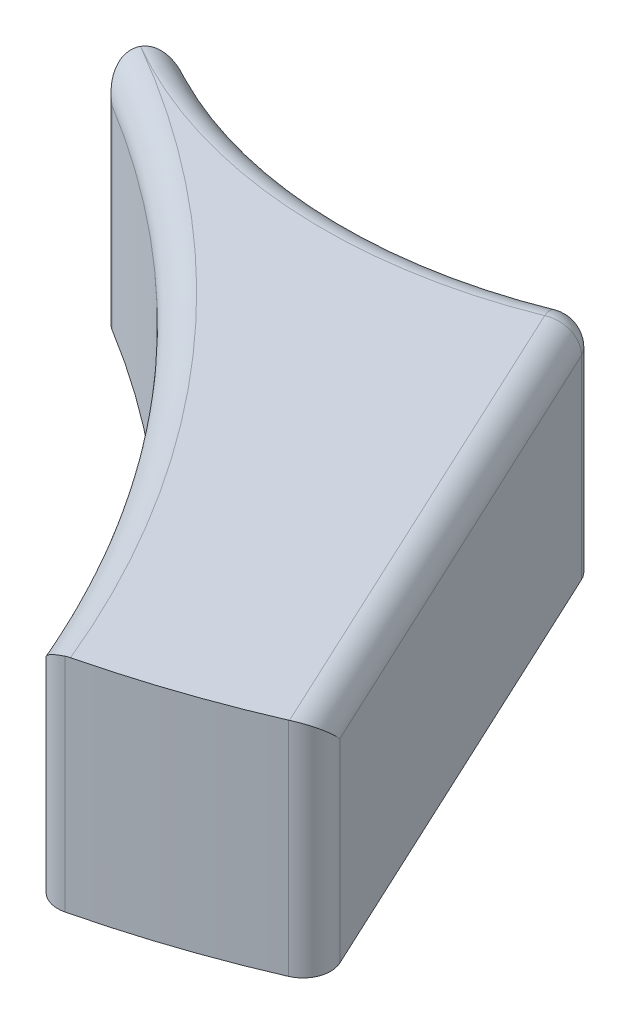
ISO-10303-21;
HEADER;
FILE_DESCRIPTION(('STEP AP214'),'2;1');
FILE_NAME('part.step','',(''),(''),'','','');
FILE_SCHEMA(('AUTOMOTIVE_DESIGN { 1 0 10303 214 1 1 1 1 }'));
ENDSEC;
DATA;
#1=APPLICATION_CONTEXT('core data for automotive mechanical design processes');
#2=APPLICATION_PROTOCOL_DEFINITION('international standard','automotive_design',2000,#1);
#3=PRODUCT_CONTEXT('',#1,'mechanical');
#4=PRODUCT('Part','Part','',(#3));
#5=PRODUCT_RELATED_PRODUCT_CATEGORY('part','',(#4));
#6=PRODUCT_DEFINITION_FORMATION('','',#4);
#7=PRODUCT_DEFINITION_CONTEXT('part definition',#1,'design');
#8=PRODUCT_DEFINITION('design','',#6,#7);
#9=PRODUCT_DEFINITION_SHAPE('','',#8);
#10=(LENGTH_UNIT() NAMED_UNIT(*) SI_UNIT(.MILLI.,.METRE.));
#11=(NAMED_UNIT(*) PLANE_ANGLE_UNIT() SI_UNIT($,.RADIAN.));
#12=(NAMED_UNIT(*) SI_UNIT($,.STERADIAN.) SOLID_ANGLE_UNIT());
#13=UNCERTAINTY_MEASURE_WITH_UNIT(LENGTH_MEASURE(1.E-05),#10,'distance_accuracy_value','');
#14=(GEOMETRIC_REPRESENTATION_CONTEXT(3) GLOBAL_UNCERTAINTY_ASSIGNED_CONTEXT((#13)) GLOBAL_UNIT_ASSIGNED_CONTEXT((#10,
#11,#12)) REPRESENTATION_CONTEXT('',''));
#15=CARTESIAN_POINT('',(0.,0.,0.));
#16=DIRECTION('',(0.,0.,1.));
#17=DIRECTION('',(1.,0.,0.));
#18=AXIS2_PLACEMENT_3D('',#15,#16,#17);
#19=CARTESIAN_POINT('',(-30.0000000000001,3.,51.9615242270664));
#20=DIRECTION('',(0.,-1.,0.));
#21=DIRECTION('',(1.,0.,0.));
#22=AXIS2_PLACEMENT_3D('',#19,#20,#21);
#23=CYLINDRICAL_SURFACE('',#22,41.0000000000002);
#24=CARTESIAN_POINT('',(-30.0000000000001,3.,51.9615242270664));
#25=DIRECTION('',(0.,-1.,0.));
#26=DIRECTION('',(0.500000000000001,0.,-0.866025403784438));
#27=AXIS2_PLACEMENT_3D('',#24,#25,#26);
#28=CIRCLE('',#27,41.0000000000002);
#29=CARTESIAN_POINT('',(-8.66040573002251,3.,16.9526436909403));
#30=VERTEX_POINT('',#29);
#31=CARTESIAN_POINT('',(7.50822965320198,3.,35.404570754804));
#32=VERTEX_POINT('',#31);
#33=EDGE_CURVE('E425',#30,#32,#28,.T.);
#34=ORIENTED_EDGE('',*,*,#33,.T.);
#35=DIRECTION('',(0.,-1.,0.));
#36=VECTOR('',#35,1.);
#37=CARTESIAN_POINT('',(7.50822965320198,2.99999999999999,35.404570754804));
#38=LINE('',#37,#36);
#39=CARTESIAN_POINT('',(7.50822965320198,10.,35.404570754804));
#40=VERTEX_POINT('',#39);
#41=EDGE_CURVE('E313',#32,#40,#38,.F.);
#42=ORIENTED_EDGE('',*,*,#41,.T.);
#43=CARTESIAN_POINT('',(-30.0000000000001,10.,51.9615242270664));
#44=DIRECTION('',(0.,1.,0.));
#45=DIRECTION('',(0.,0.,1.));
#46=AXIS2_PLACEMENT_3D('',#43,#44,#45);
#47=CIRCLE('',#46,41.0000000000002);
#48=CARTESIAN_POINT('',(-8.66040573002251,10.,16.9526436909403));
#49=VERTEX_POINT('',#48);
#50=EDGE_CURVE('E311',#40,#49,#47,.T.);
#51=ORIENTED_EDGE('',*,*,#50,.T.);
#52=DIRECTION('',(0.,-1.,0.));
#53=VECTOR('',#52,1.);
#54=CARTESIAN_POINT('',(-8.66040573002251,2.99999999999999,16.9526436909403));
#55=LINE('',#54,#53);
#56=EDGE_CURVE('E266',#49,#30,#55,.T.);
#57=ORIENTED_EDGE('',*,*,#56,.T.);
#58=EDGE_LOOP('',(#34,#42,#51,#57));
#59=FACE_BOUND('',#58,.T.);
#60=ADVANCED_FACE('F162',(#59),#23,.F.);
#61=CARTESIAN_POINT('',(0.,3.,0.));
#62=DIRECTION('',(0.,1.,0.));
#63=DIRECTION('',(0.,0.,1.));
#64=AXIS2_PLACEMENT_3D('',#61,#62,#63);
#65=PLANE('',#64);
#66=CARTESIAN_POINT('',(3.09904216494226,3.,20.8431268685845));
#67=DIRECTION('',(0.,-1.,0.));
#68=DIRECTION('',(0.,0.,-1.));
#69=AXIS2_PLACEMENT_3D('',#66,#67,#68);
#70=CIRCLE('',#69,2.);
#71=CARTESIAN_POINT('',(3.09904216494226,3.,18.8431268685845));
#72=VERTEX_POINT('',#71);
#73=EDGE_CURVE('E441',#72,#72,#70,.T.);
#74=ORIENTED_EDGE('',*,*,#73,.F.);
#75=EDGE_LOOP('',(#74));
#76=FACE_BOUND('',#75,.T.);
#77=CARTESIAN_POINT('',(9.48297317697624,3.,29.8011079376419));
#78=DIRECTION('',(0.,-1.,0.));
#79=DIRECTION('',(0.,0.,-1.));
#80=AXIS2_PLACEMENT_3D('',#77,#78,#79);
#81=CIRCLE('',#80,2.15);
#82=CARTESIAN_POINT('',(9.48297317697624,3.,27.6511079376419));
#83=VERTEX_POINT('',#82);
#84=EDGE_CURVE('E450',#83,#83,#81,.T.);
#85=ORIENTED_EDGE('',*,*,#84,.F.);
#86=EDGE_LOOP('',(#85));
#87=FACE_BOUND('',#86,.T.);
#88=DIRECTION('',(-0.422618261740701,0.,-0.906307787036649));
#89=VECTOR('',#88,1.);
#90=CARTESIAN_POINT('',(0.,3.,0.));
#91=LINE('',#90,#89);
#92=CARTESIAN_POINT('',(15.2083865918765,3.,32.6144902960637));
#93=VERTEX_POINT('',#92);
#94=CARTESIAN_POINT('',(7.59538024299141,3.,16.2883454949966));
#95=VERTEX_POINT('',#94);
#96=EDGE_CURVE('E262',#93,#95,#91,.T.);
#97=ORIENTED_EDGE('',*,*,#96,.F.);
#98=CARTESIAN_POINT('',(14.3020788048398,3.,33.0371085578044));
#99=DIRECTION('',(0.,1.,0.));
#100=DIRECTION('',(0.,0.,1.));
#101=AXIS2_PLACEMENT_3D('',#98,#99,#100);
#102=CIRCLE('',#101,1.);
#103=CARTESIAN_POINT('',(14.6993587716409,3.,33.9548060177434));
#104=VERTEX_POINT('',#103);
#105=EDGE_CURVE('E257',#93,#104,#102,.F.);
#106=ORIENTED_EDGE('',*,*,#105,.T.);
#107=CARTESIAN_POINT('',(0.,3.,0.));
#108=DIRECTION('',(0.,-1.,0.));
#109=DIRECTION('',(0.,0.,-1.));
#110=AXIS2_PLACEMENT_3D('',#107,#108,#109);
#111=CIRCLE('',#110,37.);
#112=CARTESIAN_POINT('',(8.65703853731427,3.,35.9729854719268));
#113=VERTEX_POINT('',#112);
#114=EDGE_CURVE('E260',#104,#113,#111,.T.);
#115=ORIENTED_EDGE('',*,*,#114,.T.);
#116=CARTESIAN_POINT('',(8.42306452279226,3.,35.0007426213342));
#117=DIRECTION('',(0.,1.,0.));
#118=DIRECTION('',(0.,0.,1.));
#119=AXIS2_PLACEMENT_3D('',#116,#117,#118);
#120=CIRCLE('',#119,1.);
#121=EDGE_CURVE('E267',#113,#32,#120,.F.);
#122=ORIENTED_EDGE('',*,*,#121,.T.);
#123=ORIENTED_EDGE('',*,*,#33,.F.);
#124=CARTESIAN_POINT('',(-8.13992782099866,3.,16.0987685559128));
#125=DIRECTION('',(0.,1.,0.));
#126=DIRECTION('',(0.,0.,1.));
#127=AXIS2_PLACEMENT_3D('',#124,#125,#126);
#128=CIRCLE('',#127,1.);
#129=CARTESIAN_POINT('',(-9.00595322478311,3.,15.5987685559128));
#130=VERTEX_POINT('',#129);
#131=EDGE_CURVE('E305',#30,#130,#128,.F.);
#132=ORIENTED_EDGE('',*,*,#131,.T.);
#133=DIRECTION('',(-0.499999999999998,0.,0.86602540378444));
#134=VECTOR('',#133,1.);
#135=CARTESIAN_POINT('',(-15.0000000000001,3.,25.9807621135331));
#136=LINE('',#135,#134);
#137=CARTESIAN_POINT('',(-8.98610037780584,3.,15.5643824162733));
#138=VERTEX_POINT('',#137);
#139=EDGE_CURVE('E423',#138,#130,#136,.T.);
#140=ORIENTED_EDGE('',*,*,#139,.F.);
#141=CARTESIAN_POINT('',(-8.12007497402139,3.,16.0643824162733));
#142=DIRECTION('',(0.,1.,0.));
#143=DIRECTION('',(0.,0.,1.));
#144=AXIS2_PLACEMENT_3D('',#141,#142,#143);
#145=CIRCLE('',#144,1.);
#146=CARTESIAN_POINT('',(-7.66895969768687,3.,15.1719167264804));
#147=VERTEX_POINT('',#146);
#148=EDGE_CURVE('E303',#138,#147,#145,.F.);
#149=ORIENTED_EDGE('',*,*,#148,.T.);
#150=CARTESIAN_POINT('',(0.,3.,0.));
#151=DIRECTION('',(0.,1.,0.));
#152=DIRECTION('',(0.,0.,1.));
#153=AXIS2_PLACEMENT_3D('',#150,#151,#152);
#154=CIRCLE('',#153,17.);
#155=CARTESIAN_POINT('',(6.31745731951283,3.,15.782576881363));
#156=VERTEX_POINT('',#155);
#157=EDGE_CURVE('E374',#147,#156,#154,.T.);
#158=ORIENTED_EDGE('',*,*,#157,.T.);
#159=CARTESIAN_POINT('',(6.68907245595476,3.,16.7109637567373));
#160=DIRECTION('',(0.,1.,0.));
#161=DIRECTION('',(0.,0.,1.));
#162=AXIS2_PLACEMENT_3D('',#159,#160,#161);
#163=CIRCLE('',#162,1.);
#164=EDGE_CURVE('E307',#156,#95,#163,.F.);
#165=ORIENTED_EDGE('',*,*,#164,.T.);
#166=EDGE_LOOP('',(#97,#106,#115,#122,#123,#132,#140,#149,#158,#165));
#167=FACE_BOUND('',#166,.T.);
#168=ADVANCED_FACE('F259',(#76,#87,#167),#65,.F.);
#169=CARTESIAN_POINT('',(-30.0000000000001,11.,51.9615242270664));
#170=DIRECTION('',(0.,1.,0.));
#171=DIRECTION('',(0.,0.,1.));
#172=AXIS2_PLACEMENT_3D('',#169,#170,#171);
#173=PLANE('',#172);
#174=CARTESIAN_POINT('',(0.,11.,0.));
#175=DIRECTION('',(0.,1.,0.));
#176=DIRECTION('',(0.,0.,1.));
#177=AXIS2_PLACEMENT_3D('',#174,#175,#176);
#178=CIRCLE('',#177,37.);
#179=CARTESIAN_POINT('',(8.82124083616554,11.,35.9330726505592));
#180=VERTEX_POINT('',#179);
#181=CARTESIAN_POINT('',(14.6993587716409,11.,33.9548060177434));
#182=VERTEX_POINT('',#181);
#183=EDGE_CURVE('E278',#180,#182,#178,.T.);
#184=ORIENTED_EDGE('',*,*,#183,.T.);
#185=CARTESIAN_POINT('',(14.3020788048398,11.,33.0371085578044));
#186=DIRECTION('',(0.,1.,0.));
#187=DIRECTION('',(0.,0.,1.));
#188=AXIS2_PLACEMENT_3D('',#185,#186,#187);
#189=CIRCLE('',#188,1.);
#190=CARTESIAN_POINT('',(14.7246970665805,11.,33.943416344841));
#191=VERTEX_POINT('',#190);
#192=EDGE_CURVE('E283',#182,#191,#189,.T.);
#193=ORIENTED_EDGE('',*,*,#192,.T.);
#194=DIRECTION('',(0.422618261740701,0.,0.906307787036649));
#195=VECTOR('',#194,1.);
#196=CARTESIAN_POINT('',(6.27820266255527,11.,15.8298506413638));
#197=LINE('',#196,#195);
#198=CARTESIAN_POINT('',(6.68907245595476,11.,16.7109637567373));
#199=VERTEX_POINT('',#198);
#200=EDGE_CURVE('E294',#191,#199,#197,.F.);
#201=ORIENTED_EDGE('',*,*,#200,.T.);
#202=CARTESIAN_POINT('',(0.,11.,0.));
#203=DIRECTION('',(0.,1.,0.));
#204=DIRECTION('',(0.,0.,1.));
#205=AXIS2_PLACEMENT_3D('',#202,#203,#204);
#206=CIRCLE('',#205,18.);
#207=CARTESIAN_POINT('',(-9.00000000000012,11.,15.5884572681198));
#208=VERTEX_POINT('',#207);
#209=EDGE_CURVE('E284',#199,#208,#206,.F.);
#210=ORIENTED_EDGE('',*,*,#209,.T.);
#211=CARTESIAN_POINT('',(-30.0000000000001,11.,51.9615242270664));
#212=DIRECTION('',(0.,1.,0.));
#213=DIRECTION('',(0.,0.,1.));
#214=AXIS2_PLACEMENT_3D('',#211,#212,#213);
#215=CIRCLE('',#214,42.0000000000002);
#216=EDGE_CURVE('E287',#208,#180,#215,.F.);
#217=ORIENTED_EDGE('',*,*,#216,.T.);
#218=EDGE_LOOP('',(#184,#193,#201,#210,#217));
#219=FACE_BOUND('',#218,.T.);
#220=ADVANCED_FACE('F387',(#219),#173,.T.);
#221=CARTESIAN_POINT('',(-15.0000000000001,0.,25.9807621135331));
#222=DIRECTION('',(0.86602540378444,0.,0.499999999999998));
#223=DIRECTION('',(0.499999999999998,0.,-0.86602540378444));
#224=AXIS2_PLACEMENT_3D('',#221,#222,#223);
#225=PLANE('',#224);
#226=ORIENTED_EDGE('',*,*,#139,.T.);
#227=DIRECTION('',(0.,-1.,0.));
#228=VECTOR('',#227,1.);
#229=CARTESIAN_POINT('',(-9.00595322478311,0.,15.5987685559128));
#230=LINE('',#229,#228);
#231=CARTESIAN_POINT('',(-9.0059532247831,10.9999291157171,15.5987685559128));
#232=VERTEX_POINT('',#231);
#233=EDGE_CURVE('E12',#130,#232,#230,.F.);
#234=ORIENTED_EDGE('',*,*,#233,.T.);
#235=CARTESIAN_POINT('',(-9.00000000000012,10.,15.5884572681198));
#236=DIRECTION('',(0.86602540378444,0.,0.499999999999998));
#237=DIRECTION('',(0.499999999999998,0.,-0.86602540378444));
#238=AXIS2_PLACEMENT_3D('',#235,#236,#237);
#239=CIRCLE('',#238,1.);
#240=EDGE_CURVE('E176',#232,#208,#239,.F.);
#241=ORIENTED_EDGE('',*,*,#240,.T.);
#242=CARTESIAN_POINT('',(-8.99999999999997,9.99999999999999,15.5884572681199));
#243=DIRECTION('',(0.86602540378444,0.,0.499999999999998));
#244=DIRECTION('',(0.499999999999998,0.,-0.86602540378444));
#245=AXIS2_PLACEMENT_3D('',#242,#243,#244);
#246=CIRCLE('',#245,1.);
#247=CARTESIAN_POINT('',(-8.98610037780584,10.9996135263248,15.5643824162733));
#248=VERTEX_POINT('',#247);
#249=EDGE_CURVE('E188',#208,#248,#246,.F.);
#250=ORIENTED_EDGE('',*,*,#249,.T.);
#251=DIRECTION('',(0.,1.,0.));
#252=VECTOR('',#251,1.);
#253=CARTESIAN_POINT('',(-8.98610037780584,3.00000000000002,15.5643824162733));
#254=LINE('',#253,#252);
#255=EDGE_CURVE('E322',#248,#138,#254,.F.);
#256=ORIENTED_EDGE('',*,*,#255,.T.);
#257=EDGE_LOOP('',(#226,#234,#241,#250,#256));
#258=FACE_BOUND('',#257,.T.);
#259=ADVANCED_FACE('F390',(#258),#225,.F.);
#260=CARTESIAN_POINT('',(0.,56.0832611206852,0.));
#261=DIRECTION('',(0.,-1.,0.));
#262=DIRECTION('',(0.,0.,-1.));
#263=AXIS2_PLACEMENT_3D('',#260,#261,#262);
#264=CYLINDRICAL_SURFACE('',#263,17.);
#265=CARTESIAN_POINT('',(0.,9.99999999999999,0.));
#266=DIRECTION('',(0.,1.,0.));
#267=DIRECTION('',(0.,0.,1.));
#268=AXIS2_PLACEMENT_3D('',#265,#266,#267);
#269=CIRCLE('',#268,17.);
#270=CARTESIAN_POINT('',(-7.66895969768687,9.99999999999999,15.1719167264804));
#271=VERTEX_POINT('',#270);
#272=CARTESIAN_POINT('',(6.31745731951283,9.99999999999999,15.782576881363));
#273=VERTEX_POINT('',#272);
#274=EDGE_CURVE('E315',#271,#273,#269,.T.);
#275=ORIENTED_EDGE('',*,*,#274,.T.);
#276=DIRECTION('',(0.,-1.,0.));
#277=VECTOR('',#276,1.);
#278=CARTESIAN_POINT('',(6.31745731951283,56.0832611206852,15.782576881363));
#279=LINE('',#278,#277);
#280=EDGE_CURVE('E319',#273,#156,#279,.T.);
#281=ORIENTED_EDGE('',*,*,#280,.T.);
#282=ORIENTED_EDGE('',*,*,#157,.F.);
#283=DIRECTION('',(0.,-1.,0.));
#284=VECTOR('',#283,1.);
#285=CARTESIAN_POINT('',(-7.66895969768687,56.0832611206852,15.1719167264804));
#286=LINE('',#285,#284);
#287=EDGE_CURVE('E317',#147,#271,#286,.F.);
#288=ORIENTED_EDGE('',*,*,#287,.T.);
#289=EDGE_LOOP('',(#275,#281,#282,#288));
#290=FACE_BOUND('',#289,.T.);
#291=ADVANCED_FACE('F385',(#290),#264,.F.);
#292=CARTESIAN_POINT('',(0.,-24.9420316912131,0.));
#293=DIRECTION('',(-0.906307787036649,0.,0.422618261740701));
#294=DIRECTION('',(0.422618261740701,0.,0.906307787036649));
#295=AXIS2_PLACEMENT_3D('',#292,#293,#294);
#296=PLANE('',#295);
#297=DIRECTION('',(0.422618261740701,0.,0.906307787036649));
#298=VECTOR('',#297,1.);
#299=CARTESIAN_POINT('',(15.6368756844059,10.,33.5333881203561));
#300=LINE('',#299,#298);
#301=CARTESIAN_POINT('',(7.59538024299141,10.,16.2883454949966));
#302=VERTEX_POINT('',#301);
#303=CARTESIAN_POINT('',(15.2083865918765,10.,32.6144902960637));
#304=VERTEX_POINT('',#303);
#305=EDGE_CURVE('E297',#302,#304,#300,.T.);
#306=ORIENTED_EDGE('',*,*,#305,.T.);
#307=DIRECTION('',(0.,1.,0.));
#308=VECTOR('',#307,1.);
#309=CARTESIAN_POINT('',(15.2083865918765,3.,32.6144902960637));
#310=LINE('',#309,#308);
#311=EDGE_CURVE('E301',#304,#93,#310,.F.);
#312=ORIENTED_EDGE('',*,*,#311,.T.);
#313=ORIENTED_EDGE('',*,*,#96,.T.);
#314=DIRECTION('',(0.,1.,0.));
#315=VECTOR('',#314,1.);
#316=CARTESIAN_POINT('',(7.59538024299141,11.,16.2883454949966));
#317=LINE('',#316,#315);
#318=EDGE_CURVE('E299',#95,#302,#317,.T.);
#319=ORIENTED_EDGE('',*,*,#318,.T.);
#320=EDGE_LOOP('',(#306,#312,#313,#319));
#321=FACE_BOUND('',#320,.T.);
#322=ADVANCED_FACE('F380',(#321),#296,.F.);
#323=CARTESIAN_POINT('',(0.,23.,0.));
#324=DIRECTION('',(0.,-1.,0.));
#325=DIRECTION('',(0.,0.,-1.));
#326=AXIS2_PLACEMENT_3D('',#323,#324,#325);
#327=CYLINDRICAL_SURFACE('',#326,37.);
#328=ORIENTED_EDGE('',*,*,#114,.F.);
#329=DIRECTION('',(0.,-1.,0.));
#330=VECTOR('',#329,1.);
#331=CARTESIAN_POINT('',(14.6993587716409,23.,33.9548060177434));
#332=LINE('',#331,#330);
#333=EDGE_CURVE('E274',#104,#182,#332,.F.);
#334=ORIENTED_EDGE('',*,*,#333,.T.);
#335=ORIENTED_EDGE('',*,*,#183,.F.);
#336=CARTESIAN_POINT('',(8.82124083616554,11.,35.9330726505592));
#337=CARTESIAN_POINT('',(8.79370035612737,10.9999953287554,35.9398331293365));
#338=CARTESIAN_POINT('',(8.76624659009541,10.9988227529694,35.9465394374392));
#339=CARTESIAN_POINT('',(8.71151249050661,10.9941417926965,35.9598437112107));
#340=CARTESIAN_POINT('',(8.68423215692147,10.9906334085904,35.9664416768972));
#341=CARTESIAN_POINT('',(8.65703853731427,10.9859571203239,35.9729854719268));
#342=B_SPLINE_CURVE_WITH_KNOTS('',3,(#336,#337,#338,#339,#340,#341),.UNSPECIFIED.,.F.,.F.,(4,2,
4),(0.,0.0848559305241305,0.169711847210993),.UNSPECIFIED.);
#343=CARTESIAN_POINT('',(8.65703853731427,10.985957120324,35.9729854719268));
#344=VERTEX_POINT('',#343);
#345=EDGE_CURVE('E289',#180,#344,#342,.T.);
#346=ORIENTED_EDGE('',*,*,#345,.T.);
#347=DIRECTION('',(0.,-1.,0.));
#348=VECTOR('',#347,1.);
#349=CARTESIAN_POINT('',(8.65703853731427,23.,35.9729854719268));
#350=LINE('',#349,#348);
#351=EDGE_CURVE('E277',#344,#113,#350,.T.);
#352=ORIENTED_EDGE('',*,*,#351,.T.);
#353=EDGE_LOOP('',(#328,#334,#335,#346,#352));
#354=FACE_BOUND('',#353,.T.);
#355=ADVANCED_FACE('F272',(#354),#327,.T.);
#356=CARTESIAN_POINT('',(-8.12007497402139,56.0832611206852,16.0643824162733));
#357=DIRECTION('',(0.,-1.,0.));
#358=DIRECTION('',(0.,0.,-1.));
#359=AXIS2_PLACEMENT_3D('',#356,#357,#358);
#360=CYLINDRICAL_SURFACE('',#359,1.);
#361=ORIENTED_EDGE('',*,*,#148,.F.);
#362=ORIENTED_EDGE('',*,*,#255,.F.);
#363=CARTESIAN_POINT('',(-8.98610037780584,10.9996135263248,15.5643824162733));
#364=CARTESIAN_POINT('',(-8.97477504024863,10.9989866350831,15.5447600708939));
#365=CARTESIAN_POINT('',(-8.9627950456537,10.9975829032762,15.5255575706734));
#366=CARTESIAN_POINT('',(-8.93766208676859,10.993264139295,15.488137732426));
#367=CARTESIAN_POINT('',(-8.92451014374689,10.9903504125114,15.4699195584472));
#368=CARTESIAN_POINT('',(-8.8837364156185,10.9794752360256,15.4172543995338));
#369=CARTESIAN_POINT('',(-8.85457076319556,10.9693656813,15.3844093043356));
#370=CARTESIAN_POINT('',(-8.793495515228,10.9441581211038,15.3238726590231));
#371=CARTESIAN_POINT('',(-8.76159462813411,10.9290755421525,15.2961655807195));
#372=CARTESIAN_POINT('',(-8.69598662791819,10.8947616217141,15.2458223219943));
#373=CARTESIAN_POINT('',(-8.66227541441339,10.8755205353058,15.2231983114916));
#374=CARTESIAN_POINT('',(-8.57896623299413,10.8245737839406,15.1740587899515));
#375=CARTESIAN_POINT('',(-8.52888800899917,10.7911034167413,15.1501917351882));
#376=CARTESIAN_POINT('',(-8.42861321937431,10.7194008563316,15.1116485717814));
#377=CARTESIAN_POINT('',(-8.37841662983523,10.6811586259182,15.0969922414189));
#378=CARTESIAN_POINT('',(-8.25848154726334,10.5850065712222,15.0714077424033));
#379=CARTESIAN_POINT('',(-8.18919527532943,10.5254758206449,15.0644910122786));
#380=CARTESIAN_POINT('',(-8.05406862622828,10.4027386435305,15.0642762425392));
#381=CARTESIAN_POINT('',(-7.98823047515278,10.3395298967465,15.0709868921832));
#382=CARTESIAN_POINT('',(-7.88032985079528,10.2308194680577,15.092500439688));
#383=CARTESIAN_POINT('',(-7.83713373952601,10.1857886593357,15.1042158963535));
#384=CARTESIAN_POINT('',(-7.75314865287205,10.0953426749569,15.1330753921794));
#385=CARTESIAN_POINT('',(-7.71235563307817,10.0499283012646,15.1502099821873));
#386=CARTESIAN_POINT('',(-7.67158366766795,10.0030236882327,15.1705940189057));
#387=CARTESIAN_POINT('',(-7.67027093886506,10.0015118274497,15.1712539370721));
#388=CARTESIAN_POINT('',(-7.66895969768687,9.99999999999998,15.1719167264804));
#389=B_SPLINE_CURVE_WITH_KNOTS('',3,(#363,#364,#365,#366,#367,#368,#369,#370,#371,#372,#373,
#374,#375,#376,#377,#378,#379,#380,#381,#382,#383,#384,#385,#386,#387,#388),.UNSPECIFIED.,.F.,
.F.,(4,2,2,2,2,2,2,2,2,2,2,2,4),(0.,0.067940553068101,0.135822469266324,0.270261372551224,
0.404287104031966,0.538630380224944,0.731922616253488,0.92562850504589,1.1989892792076,
1.47252441178002,1.66274252763499,1.85263077867074,1.85895534145154),.UNSPECIFIED.);
#390=EDGE_CURVE('E279',#271,#248,#389,.F.);
#391=ORIENTED_EDGE('',*,*,#390,.F.);
#392=ORIENTED_EDGE('',*,*,#287,.F.);
#393=EDGE_LOOP('',(#361,#362,#391,#392));
#394=FACE_BOUND('',#393,.T.);
#395=ADVANCED_FACE('F349',(#394),#360,.T.);
#396=CARTESIAN_POINT('',(0.,9.99999999999999,0.));
#397=DIRECTION('',(0.,1.,0.));
#398=DIRECTION('',(0.,0.,1.));
#399=AXIS2_PLACEMENT_3D('',#396,#397,#398);
#400=TOROIDAL_SURFACE('',#399,18.,1.);
#401=ORIENTED_EDGE('',*,*,#249,.F.);
#402=ORIENTED_EDGE('',*,*,#209,.F.);
#403=CARTESIAN_POINT('',(6.68907245595476,9.99999999999999,16.7109637567373));
#404=DIRECTION('',(0.928386875374294,0.,-0.371615136441931));
#405=DIRECTION('',(-0.371615136441931,0.,-0.928386875374294));
#406=AXIS2_PLACEMENT_3D('',#403,#404,#405);
#407=CIRCLE('',#406,1.);
#408=EDGE_CURVE('E333',#273,#199,#407,.T.);
#409=ORIENTED_EDGE('',*,*,#408,.F.);
#410=ORIENTED_EDGE('',*,*,#274,.F.);
#411=ORIENTED_EDGE('',*,*,#390,.T.);
#412=EDGE_LOOP('',(#401,#402,#409,#410,#411));
#413=FACE_BOUND('',#412,.T.);
#414=ADVANCED_FACE('F352',(#413),#400,.T.);
#415=CARTESIAN_POINT('',(6.68907245595476,56.0832611206852,16.7109637567373));
#416=DIRECTION('',(0.,-1.,0.));
#417=DIRECTION('',(0.,0.,-1.));
#418=AXIS2_PLACEMENT_3D('',#415,#416,#417);
#419=CYLINDRICAL_SURFACE('',#418,1.);
#420=ORIENTED_EDGE('',*,*,#164,.F.);
#421=ORIENTED_EDGE('',*,*,#280,.F.);
#422=CARTESIAN_POINT('',(6.68907245595476,10.,16.7109637567373));
#423=DIRECTION('',(0.,1.,0.));
#424=DIRECTION('',(0.,0.,1.));
#425=AXIS2_PLACEMENT_3D('',#422,#423,#424);
#426=CIRCLE('',#425,1.);
#427=EDGE_CURVE('E330',#302,#273,#426,.T.);
#428=ORIENTED_EDGE('',*,*,#427,.F.);
#429=ORIENTED_EDGE('',*,*,#318,.F.);
#430=EDGE_LOOP('',(#420,#421,#428,#429));
#431=FACE_BOUND('',#430,.T.);
#432=ADVANCED_FACE('F355',(#431),#419,.T.);
#433=CARTESIAN_POINT('',(6.68907245595476,10.,16.7109637567373));
#434=DIRECTION('',(0.,0.,1.));
#435=DIRECTION('',(1.,0.,0.));
#436=AXIS2_PLACEMENT_3D('',#433,#434,#435);
#437=SPHERICAL_SURFACE('',#436,1.);
#438=ORIENTED_EDGE('',*,*,#427,.T.);
#439=ORIENTED_EDGE('',*,*,#408,.T.);
#440=CARTESIAN_POINT('',(6.68907245595476,10.,16.7109637567373));
#441=DIRECTION('',(-0.422618261740705,0.,-0.906307787036647));
#442=DIRECTION('',(-0.906307787036647,0.,0.422618261740705));
#443=AXIS2_PLACEMENT_3D('',#440,#441,#442);
#444=CIRCLE('',#443,1.);
#445=EDGE_CURVE('E327',#302,#199,#444,.F.);
#446=ORIENTED_EDGE('',*,*,#445,.F.);
#447=EDGE_LOOP('',(#438,#439,#446));
#448=FACE_BOUND('',#447,.T.);
#449=ADVANCED_FACE('F408',(#448),#437,.T.);
#450=CARTESIAN_POINT('',(-0.906307787036649,10.,0.422618261740701));
#451=DIRECTION('',(-0.422618261740701,0.,-0.906307787036649));
#452=DIRECTION('',(-0.906307787036649,0.,0.422618261740701));
#453=AXIS2_PLACEMENT_3D('',#450,#451,#452);
#454=CYLINDRICAL_SURFACE('',#453,1.);
#455=ORIENTED_EDGE('',*,*,#445,.T.);
#456=ORIENTED_EDGE('',*,*,#200,.F.);
#457=CARTESIAN_POINT('',(14.3020788048398,10.,33.0371085578044));
#458=DIRECTION('',(-0.298836238730121,0.707106781186547,-0.640856382055788));
#459=DIRECTION('',(-0.298836238730121,-0.707106781186547,-0.640856382055788));
#460=AXIS2_PLACEMENT_3D('',#457,#458,#459);
#461=ELLIPSE('',#460,1.41421356237309,1.);
#462=EDGE_CURVE('E325',#304,#191,#461,.F.);
#463=ORIENTED_EDGE('',*,*,#462,.F.);
#464=ORIENTED_EDGE('',*,*,#305,.F.);
#465=EDGE_LOOP('',(#455,#456,#463,#464));
#466=FACE_BOUND('',#465,.T.);
#467=ADVANCED_FACE('F405',(#466),#454,.T.);
#468=CARTESIAN_POINT('',(14.3020788048398,23.,33.0371085578044));
#469=DIRECTION('',(0.,-1.,0.));
#470=DIRECTION('',(0.,0.,-1.));
#471=AXIS2_PLACEMENT_3D('',#468,#469,#470);
#472=CYLINDRICAL_SURFACE('',#471,1.);
#473=ORIENTED_EDGE('',*,*,#105,.F.);
#474=ORIENTED_EDGE('',*,*,#311,.F.);
#475=ORIENTED_EDGE('',*,*,#462,.T.);
#476=ORIENTED_EDGE('',*,*,#192,.F.);
#477=ORIENTED_EDGE('',*,*,#333,.F.);
#478=EDGE_LOOP('',(#473,#474,#475,#476,#477));
#479=FACE_BOUND('',#478,.T.);
#480=ADVANCED_FACE('F281',(#479),#472,.T.);
#481=CARTESIAN_POINT('',(-8.13992782099866,2.99999999999999,16.0987685559128));
#482=DIRECTION('',(0.,-1.,0.));
#483=DIRECTION('',(1.,0.,0.));
#484=AXIS2_PLACEMENT_3D('',#481,#482,#483);
#485=CYLINDRICAL_SURFACE('',#484,1.);
#486=ORIENTED_EDGE('',*,*,#131,.F.);
#487=ORIENTED_EDGE('',*,*,#56,.F.);
#488=CARTESIAN_POINT('',(-9.0059532247831,10.9999291157171,15.5987685559128));
#489=CARTESIAN_POINT('',(-9.0172200465564,10.9996639535204,15.6182771084588));
#490=CARTESIAN_POINT('',(-9.02781000708352,10.9986307817181,15.6381494934549));
#491=CARTESIAN_POINT('',(-9.04757467363415,10.9950667573171,15.678436159493));
#492=CARTESIAN_POINT('',(-9.05675052813988,10.9925371282495,15.6988499848339));
#493=CARTESIAN_POINT('',(-9.08192932800644,10.9828206959217,15.7602803860427));
#494=CARTESIAN_POINT('',(-9.09580042680442,10.9734995866223,15.8018649866737));
#495=CARTESIAN_POINT('',(-9.11774310476877,10.9498693782247,15.8849362617021));
#496=CARTESIAN_POINT('',(-9.12583128568451,10.9355747343541,15.9264228728564));
#497=CARTESIAN_POINT('',(-9.13670816978183,10.9028226189,16.0085025139842));
#498=CARTESIAN_POINT('',(-9.13948457433834,10.884355596967,16.049093255628));
#499=CARTESIAN_POINT('',(-9.14043886950315,10.8356247276577,16.1453730053758));
#500=CARTESIAN_POINT('',(-9.13618962802339,10.8036670246891,16.2002266112835));
#501=CARTESIAN_POINT('',(-9.11976192790415,10.735023958142,16.305604158709));
#502=CARTESIAN_POINT('',(-9.10756755350501,10.6983292238678,16.3561191787474));
#503=CARTESIAN_POINT('',(-9.07054320689296,10.6064563261108,16.4715217475903));
#504=CARTESIAN_POINT('',(-9.0426204615473,10.5497178567117,16.534167604902));
#505=CARTESIAN_POINT('',(-8.97693686546031,10.43250741753,16.6499991533313));
#506=CARTESIAN_POINT('',(-8.9391665784576,10.3720319094266,16.7031756879039));
#507=CARTESIAN_POINT('',(-8.86335703914222,10.2603826477531,16.7911348633949));
#508=CARTESIAN_POINT('',(-8.82663886518773,10.209538288982,16.8275022171636));
#509=CARTESIAN_POINT('',(-8.74866670293738,10.1072835389144,16.8937833990457));
#510=CARTESIAN_POINT('',(-8.70742163374024,10.0558744340492,16.923709585064));
#511=CARTESIAN_POINT('',(-8.66293436840977,10.0029992986873,16.9510985029696));
#512=CARTESIAN_POINT('',(-8.66167088904323,10.0014996304612,16.9518725105838));
#513=CARTESIAN_POINT('',(-8.6604057300225,10.,16.9526436909403));
#514=B_SPLINE_CURVE_WITH_KNOTS('',3,(#488,#489,#490,#491,#492,#493,#494,#495,#496,#497,#498,
#499,#500,#501,#502,#503,#504,#505,#506,#507,#508,#509,#510,#511,#512,#513),.UNSPECIFIED.,.F.,
.F.,(4,2,2,2,2,2,2,2,2,2,2,2,4),(0.,0.0675369449463643,0.135018746607601,0.268692575915386,
0.401981093067418,0.535577848157234,0.725400827361788,0.915605235608549,1.1812169470109,
1.44708411837648,1.66416630679308,1.88082821764696,1.88715278068372),.UNSPECIFIED.);
#515=EDGE_CURVE('E167',#232,#49,#514,.T.);
#516=ORIENTED_EDGE('',*,*,#515,.F.);
#517=ORIENTED_EDGE('',*,*,#233,.F.);
#518=EDGE_LOOP('',(#486,#487,#516,#517));
#519=FACE_BOUND('',#518,.T.);
#520=ADVANCED_FACE('F164',(#519),#485,.T.);
#521=CARTESIAN_POINT('',(-30.0000000000001,10.,51.9615242270664));
#522=DIRECTION('',(0.,1.,0.));
#523=DIRECTION('',(0.,0.,1.));
#524=AXIS2_PLACEMENT_3D('',#521,#522,#523);
#525=TOROIDAL_SURFACE('',#524,42.0000000000002,1.);
#526=ORIENTED_EDGE('',*,*,#515,.T.);
#527=ORIENTED_EDGE('',*,*,#50,.F.);
#528=CARTESIAN_POINT('',(8.65703853731427,10.985957120324,35.9729854719268));
#529=CARTESIAN_POINT('',(8.63289838221755,10.981805857947,35.9787982398436));
#530=CARTESIAN_POINT('',(8.60870940980489,10.9767595775031,35.9836645241882));
#531=CARTESIAN_POINT('',(8.56046934552542,10.9650158579498,35.9915580085425));
#532=CARTESIAN_POINT('',(8.53641810223553,10.958320882257,35.9945879292091));
#533=CARTESIAN_POINT('',(8.4652317043177,10.9361090561972,36.0009788734933));
#534=CARTESIAN_POINT('',(8.41853438863308,10.9183697041256,36.0017634796029));
#535=CARTESIAN_POINT('',(8.32788936633174,10.8782858102216,35.9972349256847));
#536=CARTESIAN_POINT('',(8.28392765411063,10.8559677696998,35.9919560861764));
#537=CARTESIAN_POINT('',(8.1989190287205,10.8076730316471,35.9762589145024));
#538=CARTESIAN_POINT('',(8.15788097921524,10.7816858660365,35.9658256560884));
#539=CARTESIAN_POINT('',(8.05655640391793,10.7113015659367,35.9334290264608));
#540=CARTESIAN_POINT('',(7.99869129733268,10.66487837549,35.9082840928932));
#541=CARTESIAN_POINT('',(7.89129005387127,10.5676809885636,35.8498404503203));
#542=CARTESIAN_POINT('',(7.84177672898635,10.5168954293328,35.8165200004267));
#543=CARTESIAN_POINT('',(7.73241354987109,10.3913119792398,35.7285791284567));
#544=CARTESIAN_POINT('',(7.67661555627751,10.315186680871,35.6708202767186));
#545=CARTESIAN_POINT('',(7.58118216499053,10.1608313561043,35.5460676456011));
#546=CARTESIAN_POINT('',(7.54151123823527,10.0826063655765,35.4790946065564));
#547=CARTESIAN_POINT('',(7.50942936560926,10.0029992840864,35.4072804084566));
#548=CARTESIAN_POINT('',(7.50882799837975,10.001499615936,35.4059262204608));
#549=CARTESIAN_POINT('',(7.50822965320198,10.,35.404570754804));
#550=B_SPLINE_CURVE_WITH_KNOTS('',3,(#528,#529,#530,#531,#532,#533,#534,#535,#536,#537,#538,
#539,#540,#541,#542,#543,#544,#545,#546,#547,#548,#549),.UNSPECIFIED.,.F.,.F.,(4,2,2,2,2,2,2,2,
2,2,4),(0.,0.0754499596754562,0.150787861768058,0.299835383473215,0.448043401293932,
0.596683140375665,0.830369244547912,1.06468364911601,1.39480827103032,1.72420161153596,
1.73052617457272),.UNSPECIFIED.);
#551=EDGE_CURVE('E343',#344,#40,#550,.T.);
#552=ORIENTED_EDGE('',*,*,#551,.F.);
#553=ORIENTED_EDGE('',*,*,#345,.F.);
#554=ORIENTED_EDGE('',*,*,#216,.F.);
#555=ORIENTED_EDGE('',*,*,#240,.F.);
#556=EDGE_LOOP('',(#526,#527,#552,#553,#554,#555));
#557=FACE_BOUND('',#556,.T.);
#558=ADVANCED_FACE('F361',(#557),#525,.T.);
#559=CARTESIAN_POINT('',(8.42306452279226,2.99999999999999,35.0007426213342));
#560=DIRECTION('',(0.,1.,0.));
#561=DIRECTION('',(0.,0.,1.));
#562=AXIS2_PLACEMENT_3D('',#559,#560,#561);
#563=CYLINDRICAL_SURFACE('',#562,1.);
#564=ORIENTED_EDGE('',*,*,#551,.T.);
#565=ORIENTED_EDGE('',*,*,#41,.F.);
#566=ORIENTED_EDGE('',*,*,#121,.F.);
#567=ORIENTED_EDGE('',*,*,#351,.F.);
#568=EDGE_LOOP('',(#564,#565,#566,#567));
#569=FACE_BOUND('',#568,.T.);
#570=ADVANCED_FACE('F357',(#569),#563,.T.);
#571=CARTESIAN_POINT('',(9.48297317697624,7.,29.8011079376419));
#572=DIRECTION('',(0.,-1.,0.));
#573=DIRECTION('',(0.,0.,-1.));
#574=AXIS2_PLACEMENT_3D('',#571,#572,#573);
#575=CYLINDRICAL_SURFACE('',#574,2.15);
#576=CARTESIAN_POINT('',(9.48297317697624,7.,29.8011079376419));
#577=DIRECTION('',(0.,-1.,0.));
#578=DIRECTION('',(0.,0.,-1.));
#579=AXIS2_PLACEMENT_3D('',#576,#577,#578);
#580=CIRCLE('',#579,2.15);
#581=CARTESIAN_POINT('',(9.48297317697624,7.,27.6511079376419));
#582=VERTEX_POINT('',#581);
#583=EDGE_CURVE('E446',#582,#582,#580,.T.);
#584=ORIENTED_EDGE('',*,*,#583,.F.);
#585=EDGE_LOOP('',(#584));
#586=FACE_BOUND('',#585,.T.);
#587=ORIENTED_EDGE('',*,*,#84,.T.);
#588=EDGE_LOOP('',(#587));
#589=FACE_BOUND('',#588,.T.);
#590=ADVANCED_FACE('F360',(#586,#589),#575,.F.);
#591=CARTESIAN_POINT('',(3.09904216494226,7.,20.8431268685845));
#592=DIRECTION('',(0.,-1.,0.));
#593=DIRECTION('',(0.,0.,-1.));
#594=AXIS2_PLACEMENT_3D('',#591,#592,#593);
#595=CYLINDRICAL_SURFACE('',#594,2.);
#596=CARTESIAN_POINT('',(3.09904216494226,7.,20.8431268685845));
#597=DIRECTION('',(0.,-1.,0.));
#598=DIRECTION('',(0.,0.,-1.));
#599=AXIS2_PLACEMENT_3D('',#596,#597,#598);
#600=CIRCLE('',#599,2.);
#601=CARTESIAN_POINT('',(3.09904216494226,7.,18.8431268685845));
#602=VERTEX_POINT('',#601);
#603=EDGE_CURVE('E438',#602,#602,#600,.T.);
#604=ORIENTED_EDGE('',*,*,#603,.F.);
#605=EDGE_LOOP('',(#604));
#606=FACE_BOUND('',#605,.T.);
#607=ORIENTED_EDGE('',*,*,#73,.T.);
#608=EDGE_LOOP('',(#607));
#609=FACE_BOUND('',#608,.T.);
#610=ADVANCED_FACE('F456',(#606,#609),#595,.F.);
#611=CARTESIAN_POINT('',(9.48297317697624,7.,29.8011079376419));
#612=DIRECTION('',(0.,1.,0.));
#613=DIRECTION('',(0.,0.,1.));
#614=AXIS2_PLACEMENT_3D('',#611,#612,#613);
#615=PLANE('',#614);
#616=ORIENTED_EDGE('',*,*,#583,.T.);
#617=EDGE_LOOP('',(#616));
#618=FACE_BOUND('',#617,.T.);
#619=ADVANCED_FACE('F381',(#618),#615,.F.);
#620=CARTESIAN_POINT('',(3.09904216494226,7.,20.8431268685845));
#621=DIRECTION('',(0.,1.,0.));
#622=DIRECTION('',(0.,0.,1.));
#623=AXIS2_PLACEMENT_3D('',#620,#621,#622);
#624=PLANE('',#623);
#625=ORIENTED_EDGE('',*,*,#603,.T.);
#626=EDGE_LOOP('',(#625));
#627=FACE_BOUND('',#626,.T.);
#628=ADVANCED_FACE('F465',(#627),#624,.F.);
#629=CLOSED_SHELL('',(#60,#168,#220,#259,#291,#322,#355,#395,#414,#432,#449,#467,#480,#520,#558,
#570,#590,#610,#619,#628));
#630=MANIFOLD_SOLID_BREP('B2',#629);
#631=ADVANCED_BREP_SHAPE_REPRESENTATION('',(#18,#630),#14);
#632=SHAPE_DEFINITION_REPRESENTATION(#9,#631);
ENDSEC;
END-ISO-10303-21;
